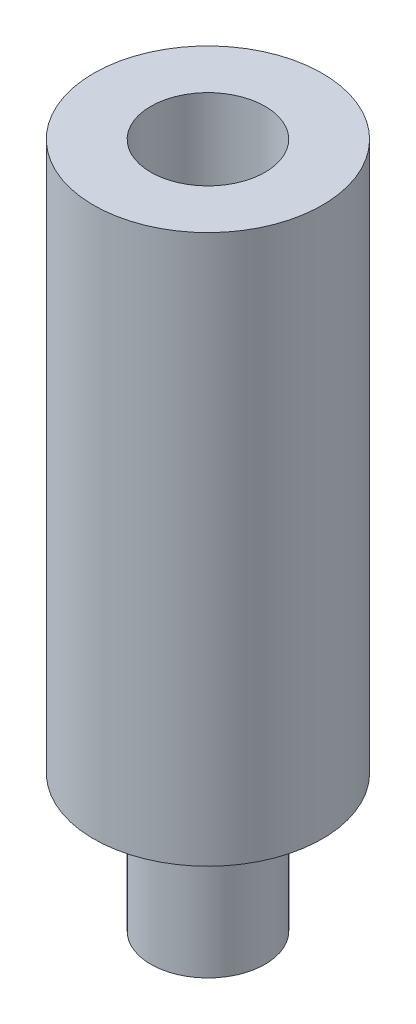
ISO-10303-21;
HEADER;
FILE_DESCRIPTION(('STEP AP214'),'2;1');
FILE_NAME('part.step','',(''),(''),'','','');
FILE_SCHEMA(('AUTOMOTIVE_DESIGN { 1 0 10303 214 1 1 1 1 }'));
ENDSEC;
DATA;
#1=APPLICATION_CONTEXT('core data for automotive mechanical design processes');
#2=APPLICATION_PROTOCOL_DEFINITION('international standard','automotive_design',2000,#1);
#3=PRODUCT_CONTEXT('',#1,'mechanical');
#4=PRODUCT('Part','Part','',(#3));
#5=PRODUCT_RELATED_PRODUCT_CATEGORY('part','',(#4));
#6=PRODUCT_DEFINITION_FORMATION('','',#4);
#7=PRODUCT_DEFINITION_CONTEXT('part definition',#1,'design');
#8=PRODUCT_DEFINITION('design','',#6,#7);
#9=PRODUCT_DEFINITION_SHAPE('','',#8);
#10=(LENGTH_UNIT() NAMED_UNIT(*) SI_UNIT(.MILLI.,.METRE.));
#11=(NAMED_UNIT(*) PLANE_ANGLE_UNIT() SI_UNIT($,.RADIAN.));
#12=(NAMED_UNIT(*) SI_UNIT($,.STERADIAN.) SOLID_ANGLE_UNIT());
#13=UNCERTAINTY_MEASURE_WITH_UNIT(LENGTH_MEASURE(1.E-05),#10,'distance_accuracy_value','');
#14=(GEOMETRIC_REPRESENTATION_CONTEXT(3) GLOBAL_UNCERTAINTY_ASSIGNED_CONTEXT((#13)) GLOBAL_UNIT_ASSIGNED_CONTEXT((#10,
#11,#12)) REPRESENTATION_CONTEXT('',''));
#15=CARTESIAN_POINT('',(0.,0.,0.));
#16=DIRECTION('',(0.,0.,1.));
#17=DIRECTION('',(1.,0.,0.));
#18=AXIS2_PLACEMENT_3D('',#15,#16,#17);
#19=CARTESIAN_POINT('',(3.175,0.,0.));
#20=DIRECTION('',(0.,-1.,0.));
#21=DIRECTION('',(1.,0.,0.));
#22=AXIS2_PLACEMENT_3D('',#19,#20,#21);
#23=PLANE('',#22);
#24=CARTESIAN_POINT('',(0.,0.,0.));
#25=DIRECTION('',(0.,1.,0.));
#26=DIRECTION('',(-1.,0.,0.));
#27=AXIS2_PLACEMENT_3D('',#24,#25,#26);
#28=CIRCLE('',#27,1.5875);
#29=CARTESIAN_POINT('',(-1.5875,0.,0.));
#30=VERTEX_POINT('',#29);
#31=EDGE_CURVE('E10',#30,#30,#28,.T.);
#32=ORIENTED_EDGE('',*,*,#31,.F.);
#33=EDGE_LOOP('',(#32));
#34=FACE_BOUND('',#33,.T.);
#35=CARTESIAN_POINT('',(0.,0.,0.));
#36=DIRECTION('',(0.,1.,0.));
#37=DIRECTION('',(-1.,0.,0.));
#38=AXIS2_PLACEMENT_3D('',#35,#36,#37);
#39=CIRCLE('',#38,3.175);
#40=CARTESIAN_POINT('',(-3.175,0.,0.));
#41=VERTEX_POINT('',#40);
#42=EDGE_CURVE('E54',#41,#41,#39,.T.);
#43=ORIENTED_EDGE('',*,*,#42,.T.);
#44=EDGE_LOOP('',(#43));
#45=FACE_BOUND('',#44,.T.);
#46=ADVANCED_FACE('F32',(#34,#45),#23,.F.);
#47=CARTESIAN_POINT('',(0.,-3.81,0.));
#48=DIRECTION('',(0.,1.,0.));
#49=DIRECTION('',(-1.,0.,0.));
#50=AXIS2_PLACEMENT_3D('',#47,#48,#49);
#51=CYLINDRICAL_SURFACE('',#50,1.5875);
#52=CARTESIAN_POINT('',(0.,-3.81,0.));
#53=DIRECTION('',(0.,1.,0.));
#54=DIRECTION('',(-1.,0.,0.));
#55=AXIS2_PLACEMENT_3D('',#52,#53,#54);
#56=CIRCLE('',#55,1.5875);
#57=CARTESIAN_POINT('',(-1.5875,-3.81,0.));
#58=VERTEX_POINT('',#57);
#59=EDGE_CURVE('E38',#58,#58,#56,.T.);
#60=ORIENTED_EDGE('',*,*,#59,.F.);
#61=EDGE_LOOP('',(#60));
#62=FACE_BOUND('',#61,.T.);
#63=ORIENTED_EDGE('',*,*,#31,.T.);
#64=EDGE_LOOP('',(#63));
#65=FACE_BOUND('',#64,.T.);
#66=ADVANCED_FACE('F84',(#62,#65),#51,.F.);
#67=CARTESIAN_POINT('',(1.5875,-3.81,0.));
#68=DIRECTION('',(0.,-1.,0.));
#69=DIRECTION('',(1.,0.,0.));
#70=AXIS2_PLACEMENT_3D('',#67,#68,#69);
#71=PLANE('',#70);
#72=ORIENTED_EDGE('',*,*,#59,.T.);
#73=EDGE_LOOP('',(#72));
#74=FACE_BOUND('',#73,.T.);
#75=ADVANCED_FACE('F79',(#74),#71,.F.);
#76=CARTESIAN_POINT('',(1.5875,-19.05,0.));
#77=DIRECTION('',(0.,1.,0.));
#78=DIRECTION('',(-1.,0.,0.));
#79=AXIS2_PLACEMENT_3D('',#76,#77,#78);
#80=PLANE('',#79);
#81=CARTESIAN_POINT('',(0.,-19.05,0.));
#82=DIRECTION('',(0.,1.,0.));
#83=DIRECTION('',(-1.,0.,0.));
#84=AXIS2_PLACEMENT_3D('',#81,#82,#83);
#85=CIRCLE('',#84,1.5875);
#86=CARTESIAN_POINT('',(-1.5875,-19.05,0.));
#87=VERTEX_POINT('',#86);
#88=EDGE_CURVE('E42',#87,#87,#85,.T.);
#89=ORIENTED_EDGE('',*,*,#88,.F.);
#90=EDGE_LOOP('',(#89));
#91=FACE_BOUND('',#90,.T.);
#92=ADVANCED_FACE('F74',(#91),#80,.F.);
#93=CARTESIAN_POINT('',(0.,-3.81,0.));
#94=DIRECTION('',(0.,1.,0.));
#95=DIRECTION('',(-1.,0.,0.));
#96=AXIS2_PLACEMENT_3D('',#93,#94,#95);
#97=CYLINDRICAL_SURFACE('',#96,1.5875);
#98=CARTESIAN_POINT('',(0.,-15.24,0.));
#99=DIRECTION('',(0.,1.,0.));
#100=DIRECTION('',(-1.,0.,0.));
#101=AXIS2_PLACEMENT_3D('',#98,#99,#100);
#102=CIRCLE('',#101,1.5875);
#103=CARTESIAN_POINT('',(-1.5875,-15.24,0.));
#104=VERTEX_POINT('',#103);
#105=EDGE_CURVE('E46',#104,#104,#102,.T.);
#106=ORIENTED_EDGE('',*,*,#105,.F.);
#107=EDGE_LOOP('',(#106));
#108=FACE_BOUND('',#107,.T.);
#109=ORIENTED_EDGE('',*,*,#88,.T.);
#110=EDGE_LOOP('',(#109));
#111=FACE_BOUND('',#110,.T.);
#112=ADVANCED_FACE('F68',(#108,#111),#97,.T.);
#113=CARTESIAN_POINT('',(3.175,-15.24,0.));
#114=DIRECTION('',(0.,1.,0.));
#115=DIRECTION('',(-1.,0.,0.));
#116=AXIS2_PLACEMENT_3D('',#113,#114,#115);
#117=PLANE('',#116);
#118=CARTESIAN_POINT('',(0.,-15.24,0.));
#119=DIRECTION('',(0.,1.,0.));
#120=DIRECTION('',(-1.,0.,0.));
#121=AXIS2_PLACEMENT_3D('',#118,#119,#120);
#122=CIRCLE('',#121,3.175);
#123=CARTESIAN_POINT('',(-3.175,-15.24,0.));
#124=VERTEX_POINT('',#123);
#125=EDGE_CURVE('E51',#124,#124,#122,.T.);
#126=ORIENTED_EDGE('',*,*,#125,.F.);
#127=EDGE_LOOP('',(#126));
#128=FACE_BOUND('',#127,.T.);
#129=ORIENTED_EDGE('',*,*,#105,.T.);
#130=EDGE_LOOP('',(#129));
#131=FACE_BOUND('',#130,.T.);
#132=ADVANCED_FACE('F62',(#128,#131),#117,.F.);
#133=CARTESIAN_POINT('',(0.,-3.81,0.));
#134=DIRECTION('',(0.,1.,0.));
#135=DIRECTION('',(-1.,0.,0.));
#136=AXIS2_PLACEMENT_3D('',#133,#134,#135);
#137=CYLINDRICAL_SURFACE('',#136,3.175);
#138=ORIENTED_EDGE('',*,*,#42,.F.);
#139=EDGE_LOOP('',(#138));
#140=FACE_BOUND('',#139,.T.);
#141=ORIENTED_EDGE('',*,*,#125,.T.);
#142=EDGE_LOOP('',(#141));
#143=FACE_BOUND('',#142,.T.);
#144=ADVANCED_FACE('F59',(#140,#143),#137,.T.);
#145=CLOSED_SHELL('',(#46,#66,#75,#92,#112,#132,#144));
#146=MANIFOLD_SOLID_BREP('B2',#145);
#147=ADVANCED_BREP_SHAPE_REPRESENTATION('',(#18,#146),#14);
#148=SHAPE_DEFINITION_REPRESENTATION(#9,#147);
ENDSEC;
END-ISO-10303-21;
